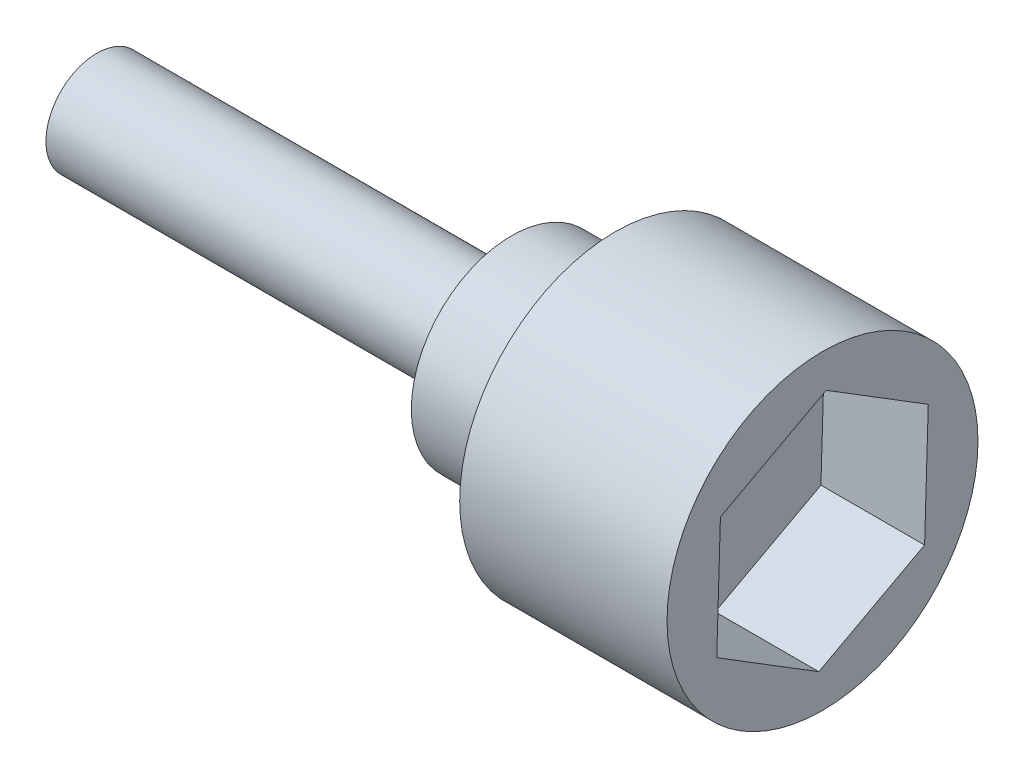
ISO-10303-21;
HEADER;
FILE_DESCRIPTION(('STEP AP214'),'2;1');
FILE_NAME('part.step','',(''),(''),'','','');
FILE_SCHEMA(('AUTOMOTIVE_DESIGN { 1 0 10303 214 1 1 1 1 }'));
ENDSEC;
DATA;
#1=APPLICATION_CONTEXT('core data for automotive mechanical design processes');
#2=APPLICATION_PROTOCOL_DEFINITION('international standard','automotive_design',2000,#1);
#3=PRODUCT_CONTEXT('',#1,'mechanical');
#4=PRODUCT('Part','Part','',(#3));
#5=PRODUCT_RELATED_PRODUCT_CATEGORY('part','',(#4));
#6=PRODUCT_DEFINITION_FORMATION('','',#4);
#7=PRODUCT_DEFINITION_CONTEXT('part definition',#1,'design');
#8=PRODUCT_DEFINITION('design','',#6,#7);
#9=PRODUCT_DEFINITION_SHAPE('','',#8);
#10=(LENGTH_UNIT() NAMED_UNIT(*) SI_UNIT(.MILLI.,.METRE.));
#11=(NAMED_UNIT(*) PLANE_ANGLE_UNIT() SI_UNIT($,.RADIAN.));
#12=(NAMED_UNIT(*) SI_UNIT($,.STERADIAN.) SOLID_ANGLE_UNIT());
#13=UNCERTAINTY_MEASURE_WITH_UNIT(LENGTH_MEASURE(1.E-05),#10,'distance_accuracy_value','');
#14=(GEOMETRIC_REPRESENTATION_CONTEXT(3) GLOBAL_UNCERTAINTY_ASSIGNED_CONTEXT((#13)) GLOBAL_UNIT_ASSIGNED_CONTEXT((#10,
#11,#12)) REPRESENTATION_CONTEXT('',''));
#15=CARTESIAN_POINT('',(0.,0.,0.));
#16=DIRECTION('',(0.,0.,1.));
#17=DIRECTION('',(1.,0.,0.));
#18=AXIS2_PLACEMENT_3D('',#15,#16,#17);
#19=CARTESIAN_POINT('',(14.,0.,0.));
#20=DIRECTION('',(-1.,0.,0.));
#21=DIRECTION('',(0.,0.,1.));
#22=AXIS2_PLACEMENT_3D('',#19,#20,#21);
#23=CYLINDRICAL_SURFACE('',#22,1.9334);
#24=CARTESIAN_POINT('',(8.,0.,0.));
#25=DIRECTION('',(1.,0.,0.));
#26=DIRECTION('',(0.,0.,-1.));
#27=AXIS2_PLACEMENT_3D('',#24,#25,#26);
#28=CIRCLE('',#27,1.9334);
#29=CARTESIAN_POINT('',(8.,0.,-1.9334));
#30=VERTEX_POINT('',#29);
#31=EDGE_CURVE('E148',#30,#30,#28,.T.);
#32=ORIENTED_EDGE('',*,*,#31,.T.);
#33=EDGE_LOOP('',(#32));
#34=FACE_BOUND('',#33,.T.);
#35=CARTESIAN_POINT('',(10.,0.,0.));
#36=DIRECTION('',(1.,0.,0.));
#37=DIRECTION('',(0.,0.,-1.));
#38=AXIS2_PLACEMENT_3D('',#35,#36,#37);
#39=CIRCLE('',#38,1.9334);
#40=CARTESIAN_POINT('',(10.,0.,-1.9334));
#41=VERTEX_POINT('',#40);
#42=EDGE_CURVE('E11',#41,#41,#39,.T.);
#43=ORIENTED_EDGE('',*,*,#42,.F.);
#44=EDGE_LOOP('',(#43));
#45=FACE_BOUND('',#44,.T.);
#46=ADVANCED_FACE('F37',(#34,#45),#23,.T.);
#47=CARTESIAN_POINT('',(8.,0.,0.));
#48=DIRECTION('',(-1.,0.,0.));
#49=DIRECTION('',(0.,0.,1.));
#50=AXIS2_PLACEMENT_3D('',#47,#48,#49);
#51=CYLINDRICAL_SURFACE('',#50,0.9834);
#52=CARTESIAN_POINT('',(8.,0.,0.));
#53=DIRECTION('',(1.,0.,0.));
#54=DIRECTION('',(0.,0.,-1.));
#55=AXIS2_PLACEMENT_3D('',#52,#53,#54);
#56=CIRCLE('',#55,0.9834);
#57=CARTESIAN_POINT('',(8.,0.,-0.9834));
#58=VERTEX_POINT('',#57);
#59=EDGE_CURVE('E45',#58,#58,#56,.T.);
#60=ORIENTED_EDGE('',*,*,#59,.F.);
#61=EDGE_LOOP('',(#60));
#62=FACE_BOUND('',#61,.T.);
#63=CARTESIAN_POINT('',(0.,0.,0.));
#64=DIRECTION('',(1.,0.,0.));
#65=DIRECTION('',(0.,0.,-1.));
#66=AXIS2_PLACEMENT_3D('',#63,#64,#65);
#67=CIRCLE('',#66,0.9834);
#68=CARTESIAN_POINT('',(0.,0.,-0.9834));
#69=VERTEX_POINT('',#68);
#70=EDGE_CURVE('E153',#69,#69,#67,.T.);
#71=ORIENTED_EDGE('',*,*,#70,.T.);
#72=EDGE_LOOP('',(#71));
#73=FACE_BOUND('',#72,.T.);
#74=ADVANCED_FACE('F39',(#62,#73),#51,.T.);
#75=CARTESIAN_POINT('',(0.,0.,0.));
#76=DIRECTION('',(1.,0.,0.));
#77=DIRECTION('',(0.,0.,-1.));
#78=AXIS2_PLACEMENT_3D('',#75,#76,#77);
#79=PLANE('',#78);
#80=ORIENTED_EDGE('',*,*,#70,.F.);
#81=EDGE_LOOP('',(#80));
#82=FACE_BOUND('',#81,.T.);
#83=ADVANCED_FACE('F159',(#82),#79,.F.);
#84=CARTESIAN_POINT('',(8.,0.,0.));
#85=DIRECTION('',(1.,0.,0.));
#86=DIRECTION('',(0.,0.,-1.));
#87=AXIS2_PLACEMENT_3D('',#84,#85,#86);
#88=PLANE('',#87);
#89=ORIENTED_EDGE('',*,*,#59,.T.);
#90=EDGE_LOOP('',(#89));
#91=FACE_BOUND('',#90,.T.);
#92=ORIENTED_EDGE('',*,*,#31,.F.);
#93=EDGE_LOOP('',(#92));
#94=FACE_BOUND('',#93,.T.);
#95=ADVANCED_FACE('F161',(#91,#94),#88,.F.);
#96=CARTESIAN_POINT('',(10.,0.,0.));
#97=DIRECTION('',(1.,0.,0.));
#98=DIRECTION('',(0.,0.,-1.));
#99=AXIS2_PLACEMENT_3D('',#96,#97,#98);
#100=CYLINDRICAL_SURFACE('',#99,3.);
#101=CARTESIAN_POINT('',(10.,0.,0.));
#102=DIRECTION('',(1.,0.,0.));
#103=DIRECTION('',(0.,0.,-1.));
#104=AXIS2_PLACEMENT_3D('',#101,#102,#103);
#105=CIRCLE('',#104,3.);
#106=CARTESIAN_POINT('',(10.,0.,-3.));
#107=VERTEX_POINT('',#106);
#108=EDGE_CURVE('E145',#107,#107,#105,.T.);
#109=ORIENTED_EDGE('',*,*,#108,.T.);
#110=EDGE_LOOP('',(#109));
#111=FACE_BOUND('',#110,.T.);
#112=CARTESIAN_POINT('',(14.,0.,0.));
#113=DIRECTION('',(1.,0.,0.));
#114=DIRECTION('',(0.,0.,-1.));
#115=AXIS2_PLACEMENT_3D('',#112,#113,#114);
#116=CIRCLE('',#115,3.);
#117=CARTESIAN_POINT('',(14.,0.,-3.));
#118=VERTEX_POINT('',#117);
#119=EDGE_CURVE('E139',#118,#118,#116,.T.);
#120=ORIENTED_EDGE('',*,*,#119,.F.);
#121=EDGE_LOOP('',(#120));
#122=FACE_BOUND('',#121,.T.);
#123=ADVANCED_FACE('F166',(#111,#122),#100,.T.);
#124=CARTESIAN_POINT('',(10.,0.,0.));
#125=DIRECTION('',(1.,0.,0.));
#126=DIRECTION('',(0.,0.,-1.));
#127=AXIS2_PLACEMENT_3D('',#124,#125,#126);
#128=PLANE('',#127);
#129=ORIENTED_EDGE('',*,*,#42,.T.);
#130=EDGE_LOOP('',(#129));
#131=FACE_BOUND('',#130,.T.);
#132=ORIENTED_EDGE('',*,*,#108,.F.);
#133=EDGE_LOOP('',(#132));
#134=FACE_BOUND('',#133,.T.);
#135=ADVANCED_FACE('F181',(#131,#134),#128,.F.);
#136=CARTESIAN_POINT('',(14.,0.,0.));
#137=DIRECTION('',(1.,0.,0.));
#138=DIRECTION('',(0.,0.,-1.));
#139=AXIS2_PLACEMENT_3D('',#136,#137,#138);
#140=PLANE('',#139);
#141=DIRECTION('',(0.,0.999529857523412,-0.0306604618234492));
#142=VECTOR('',#141,1.);
#143=CARTESIAN_POINT('',(14.,-1.21919284696982,-1.96965660224995));
#144=LINE('',#143,#142);
#145=CARTESIAN_POINT('',(14.,-1.21919284696982,-1.96965660224995));
#146=VERTEX_POINT('',#145);
#147=CARTESIAN_POINT('',(14.,1.09617623079529,-2.04068027871311));
#148=VERTEX_POINT('',#147);
#149=EDGE_CURVE('E52',#146,#148,#144,.T.);
#150=ORIENTED_EDGE('',*,*,#149,.F.);
#151=DIRECTION('',(0.,0.473212189930836,-0.88094847936804));
#152=VECTOR('',#151,1.);
#153=CARTESIAN_POINT('',(14.,-2.3153690777651,0.0710236764631615));
#154=LINE('',#153,#152);
#155=CARTESIAN_POINT('',(14.,-2.3153690777651,0.0710236764631615));
#156=VERTEX_POINT('',#155);
#157=EDGE_CURVE('E135',#156,#146,#154,.T.);
#158=ORIENTED_EDGE('',*,*,#157,.F.);
#159=DIRECTION('',(0.,-0.526317667592577,-0.85028801754459));
#160=VECTOR('',#159,1.);
#161=CARTESIAN_POINT('',(14.,-1.09617623079529,2.04068027871311));
#162=LINE('',#161,#160);
#163=CARTESIAN_POINT('',(14.,-1.09617623079529,2.04068027871311));
#164=VERTEX_POINT('',#163);
#165=EDGE_CURVE('E133',#164,#156,#162,.T.);
#166=ORIENTED_EDGE('',*,*,#165,.F.);
#167=DIRECTION('',(0.,-0.999529857523412,0.0306604618234498));
#168=VECTOR('',#167,1.);
#169=CARTESIAN_POINT('',(14.,1.21919284696982,1.96965660224995));
#170=LINE('',#169,#168);
#171=CARTESIAN_POINT('',(14.,1.21919284696982,1.96965660224995));
#172=VERTEX_POINT('',#171);
#173=EDGE_CURVE('E100',#172,#164,#170,.T.);
#174=ORIENTED_EDGE('',*,*,#173,.F.);
#175=DIRECTION('',(0.,-0.473212189930836,0.88094847936804));
#176=VECTOR('',#175,1.);
#177=CARTESIAN_POINT('',(14.,2.3153690777651,-0.0710236764631614));
#178=LINE('',#177,#176);
#179=CARTESIAN_POINT('',(14.,2.3153690777651,-0.0710236764631614));
#180=VERTEX_POINT('',#179);
#181=EDGE_CURVE('E129',#180,#172,#178,.T.);
#182=ORIENTED_EDGE('',*,*,#181,.F.);
#183=DIRECTION('',(0.,0.526317667592576,0.850288017544591));
#184=VECTOR('',#183,1.);
#185=CARTESIAN_POINT('',(14.,1.09617623079529,-2.04068027871311));
#186=LINE('',#185,#184);
#187=EDGE_CURVE('E126',#148,#180,#186,.T.);
#188=ORIENTED_EDGE('',*,*,#187,.F.);
#189=EDGE_LOOP('',(#150,#158,#166,#174,#182,#188));
#190=FACE_BOUND('',#189,.T.);
#191=ORIENTED_EDGE('',*,*,#119,.T.);
#192=EDGE_LOOP('',(#191));
#193=FACE_BOUND('',#192,.T.);
#194=ADVANCED_FACE('F177',(#190,#193),#140,.T.);
#195=CARTESIAN_POINT('',(12.,-1.21919284696982,-1.96965660224995));
#196=DIRECTION('',(0.,-0.0306604618234492,-0.999529857523412));
#197=DIRECTION('',(0.,0.999529857523412,-0.0306604618234492));
#198=AXIS2_PLACEMENT_3D('',#195,#196,#197);
#199=PLANE('',#198);
#200=ORIENTED_EDGE('',*,*,#149,.T.);
#201=DIRECTION('',(1.,0.,0.));
#202=VECTOR('',#201,1.);
#203=CARTESIAN_POINT('',(12.,1.09617623079529,-2.04068027871311));
#204=LINE('',#203,#202);
#205=CARTESIAN_POINT('',(12.,1.09617623079529,-2.04068027871311));
#206=VERTEX_POINT('',#205);
#207=EDGE_CURVE('E82',#206,#148,#204,.T.);
#208=ORIENTED_EDGE('',*,*,#207,.F.);
#209=DIRECTION('',(0.,0.999529857523412,-0.0306604618234492));
#210=VECTOR('',#209,1.);
#211=CARTESIAN_POINT('',(12.,-1.21919284696982,-1.96965660224995));
#212=LINE('',#211,#210);
#213=CARTESIAN_POINT('',(12.,-1.21919284696982,-1.96965660224995));
#214=VERTEX_POINT('',#213);
#215=EDGE_CURVE('E137',#214,#206,#212,.T.);
#216=ORIENTED_EDGE('',*,*,#215,.F.);
#217=DIRECTION('',(1.,0.,0.));
#218=VECTOR('',#217,1.);
#219=CARTESIAN_POINT('',(12.,-1.21919284696982,-1.96965660224995));
#220=LINE('',#219,#218);
#221=EDGE_CURVE('E60',#214,#146,#220,.T.);
#222=ORIENTED_EDGE('',*,*,#221,.T.);
#223=EDGE_LOOP('',(#200,#208,#216,#222));
#224=FACE_BOUND('',#223,.T.);
#225=ADVANCED_FACE('F180',(#224),#199,.F.);
#226=CARTESIAN_POINT('',(12.,-2.3153690777651,0.0710236764631615));
#227=DIRECTION('',(0.,-0.88094847936804,-0.473212189930836));
#228=DIRECTION('',(0.,0.473212189930836,-0.88094847936804));
#229=AXIS2_PLACEMENT_3D('',#226,#227,#228);
#230=PLANE('',#229);
#231=ORIENTED_EDGE('',*,*,#157,.T.);
#232=ORIENTED_EDGE('',*,*,#221,.F.);
#233=DIRECTION('',(0.,0.473212189930836,-0.88094847936804));
#234=VECTOR('',#233,1.);
#235=CARTESIAN_POINT('',(12.,-2.3153690777651,0.0710236764631615));
#236=LINE('',#235,#234);
#237=CARTESIAN_POINT('',(12.,-2.3153690777651,0.0710236764631615));
#238=VERTEX_POINT('',#237);
#239=EDGE_CURVE('E112',#238,#214,#236,.T.);
#240=ORIENTED_EDGE('',*,*,#239,.F.);
#241=DIRECTION('',(1.,0.,0.));
#242=VECTOR('',#241,1.);
#243=CARTESIAN_POINT('',(12.,-2.3153690777651,0.0710236764631615));
#244=LINE('',#243,#242);
#245=EDGE_CURVE('E104',#238,#156,#244,.T.);
#246=ORIENTED_EDGE('',*,*,#245,.T.);
#247=EDGE_LOOP('',(#231,#232,#240,#246));
#248=FACE_BOUND('',#247,.T.);
#249=ADVANCED_FACE('F191',(#248),#230,.F.);
#250=CARTESIAN_POINT('',(12.,-1.09617623079529,2.04068027871311));
#251=DIRECTION('',(0.,-0.85028801754459,0.526317667592577));
#252=DIRECTION('',(0.,-0.526317667592577,-0.85028801754459));
#253=AXIS2_PLACEMENT_3D('',#250,#251,#252);
#254=PLANE('',#253);
#255=ORIENTED_EDGE('',*,*,#165,.T.);
#256=ORIENTED_EDGE('',*,*,#245,.F.);
#257=DIRECTION('',(0.,-0.526317667592577,-0.85028801754459));
#258=VECTOR('',#257,1.);
#259=CARTESIAN_POINT('',(12.,-1.09617623079529,2.04068027871311));
#260=LINE('',#259,#258);
#261=CARTESIAN_POINT('',(12.,-1.09617623079529,2.04068027871311));
#262=VERTEX_POINT('',#261);
#263=EDGE_CURVE('E108',#262,#238,#260,.T.);
#264=ORIENTED_EDGE('',*,*,#263,.F.);
#265=DIRECTION('',(1.,0.,0.));
#266=VECTOR('',#265,1.);
#267=CARTESIAN_POINT('',(12.,-1.09617623079529,2.04068027871311));
#268=LINE('',#267,#266);
#269=EDGE_CURVE('E93',#262,#164,#268,.T.);
#270=ORIENTED_EDGE('',*,*,#269,.T.);
#271=EDGE_LOOP('',(#255,#256,#264,#270));
#272=FACE_BOUND('',#271,.T.);
#273=ADVANCED_FACE('F109',(#272),#254,.F.);
#274=CARTESIAN_POINT('',(12.,1.21919284696982,1.96965660224995));
#275=DIRECTION('',(0.,0.0306604618234498,0.999529857523412));
#276=DIRECTION('',(0.,-0.999529857523412,0.0306604618234498));
#277=AXIS2_PLACEMENT_3D('',#274,#275,#276);
#278=PLANE('',#277);
#279=ORIENTED_EDGE('',*,*,#173,.T.);
#280=ORIENTED_EDGE('',*,*,#269,.F.);
#281=DIRECTION('',(0.,-0.999529857523412,0.0306604618234498));
#282=VECTOR('',#281,1.);
#283=CARTESIAN_POINT('',(12.,1.21919284696982,1.96965660224995));
#284=LINE('',#283,#282);
#285=CARTESIAN_POINT('',(12.,1.21919284696982,1.96965660224995));
#286=VERTEX_POINT('',#285);
#287=EDGE_CURVE('E97',#286,#262,#284,.T.);
#288=ORIENTED_EDGE('',*,*,#287,.F.);
#289=DIRECTION('',(1.,0.,0.));
#290=VECTOR('',#289,1.);
#291=CARTESIAN_POINT('',(12.,1.21919284696982,1.96965660224995));
#292=LINE('',#291,#290);
#293=EDGE_CURVE('E105',#286,#172,#292,.T.);
#294=ORIENTED_EDGE('',*,*,#293,.T.);
#295=EDGE_LOOP('',(#279,#280,#288,#294));
#296=FACE_BOUND('',#295,.T.);
#297=ADVANCED_FACE('F95',(#296),#278,.F.);
#298=CARTESIAN_POINT('',(12.,2.3153690777651,-0.0710236764631614));
#299=DIRECTION('',(0.,0.88094847936804,0.473212189930836));
#300=DIRECTION('',(0.,-0.473212189930836,0.88094847936804));
#301=AXIS2_PLACEMENT_3D('',#298,#299,#300);
#302=PLANE('',#301);
#303=ORIENTED_EDGE('',*,*,#181,.T.);
#304=ORIENTED_EDGE('',*,*,#293,.F.);
#305=DIRECTION('',(0.,-0.473212189930836,0.88094847936804));
#306=VECTOR('',#305,1.);
#307=CARTESIAN_POINT('',(12.,2.3153690777651,-0.0710236764631614));
#308=LINE('',#307,#306);
#309=CARTESIAN_POINT('',(12.,2.3153690777651,-0.0710236764631614));
#310=VERTEX_POINT('',#309);
#311=EDGE_CURVE('E118',#310,#286,#308,.T.);
#312=ORIENTED_EDGE('',*,*,#311,.F.);
#313=DIRECTION('',(1.,0.,0.));
#314=VECTOR('',#313,1.);
#315=CARTESIAN_POINT('',(12.,2.3153690777651,-0.0710236764631614));
#316=LINE('',#315,#314);
#317=EDGE_CURVE('E142',#310,#180,#316,.T.);
#318=ORIENTED_EDGE('',*,*,#317,.T.);
#319=EDGE_LOOP('',(#303,#304,#312,#318));
#320=FACE_BOUND('',#319,.T.);
#321=ADVANCED_FACE('F195',(#320),#302,.F.);
#322=CARTESIAN_POINT('',(12.,1.09617623079529,-2.04068027871311));
#323=DIRECTION('',(0.,0.850288017544591,-0.526317667592576));
#324=DIRECTION('',(0.,0.526317667592576,0.850288017544591));
#325=AXIS2_PLACEMENT_3D('',#322,#323,#324);
#326=PLANE('',#325);
#327=ORIENTED_EDGE('',*,*,#187,.T.);
#328=ORIENTED_EDGE('',*,*,#317,.F.);
#329=DIRECTION('',(0.,0.526317667592576,0.850288017544591));
#330=VECTOR('',#329,1.);
#331=CARTESIAN_POINT('',(12.,1.09617623079529,-2.04068027871311));
#332=LINE('',#331,#330);
#333=EDGE_CURVE('E120',#206,#310,#332,.T.);
#334=ORIENTED_EDGE('',*,*,#333,.F.);
#335=ORIENTED_EDGE('',*,*,#207,.T.);
#336=EDGE_LOOP('',(#327,#328,#334,#335));
#337=FACE_BOUND('',#336,.T.);
#338=ADVANCED_FACE('F192',(#337),#326,.F.);
#339=CARTESIAN_POINT('',(12.,0.,0.));
#340=DIRECTION('',(1.,0.,0.));
#341=DIRECTION('',(0.,0.,-1.));
#342=AXIS2_PLACEMENT_3D('',#339,#340,#341);
#343=PLANE('',#342);
#344=ORIENTED_EDGE('',*,*,#215,.T.);
#345=ORIENTED_EDGE('',*,*,#333,.T.);
#346=ORIENTED_EDGE('',*,*,#311,.T.);
#347=ORIENTED_EDGE('',*,*,#287,.T.);
#348=ORIENTED_EDGE('',*,*,#263,.T.);
#349=ORIENTED_EDGE('',*,*,#239,.T.);
#350=EDGE_LOOP('',(#344,#345,#346,#347,#348,#349));
#351=FACE_BOUND('',#350,.T.);
#352=ADVANCED_FACE('F115',(#351),#343,.T.);
#353=CLOSED_SHELL('',(#46,#74,#83,#95,#123,#135,#194,#225,#249,#273,#297,#321,#338,#352));
#354=MANIFOLD_SOLID_BREP('B2',#353);
#355=ADVANCED_BREP_SHAPE_REPRESENTATION('',(#18,#354),#14);
#356=SHAPE_DEFINITION_REPRESENTATION(#9,#355);
ENDSEC;
END-ISO-10303-21;
